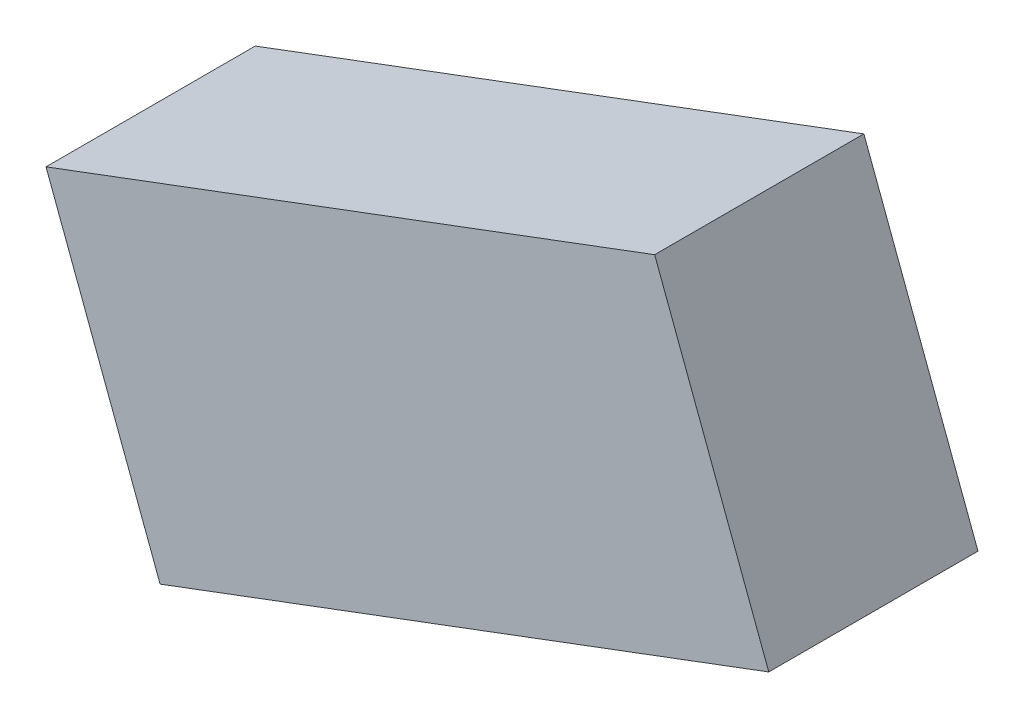
ISO-10303-21;
HEADER;
FILE_DESCRIPTION(('STEP AP214'),'2;1');
FILE_NAME('part.step','',(''),(''),'','','');
FILE_SCHEMA(('AUTOMOTIVE_DESIGN { 1 0 10303 214 1 1 1 1 }'));
ENDSEC;
DATA;
#1=APPLICATION_CONTEXT('core data for automotive mechanical design processes');
#2=APPLICATION_PROTOCOL_DEFINITION('international standard','automotive_design',2000,#1);
#3=PRODUCT_CONTEXT('',#1,'mechanical');
#4=PRODUCT('Part','Part','',(#3));
#5=PRODUCT_RELATED_PRODUCT_CATEGORY('part','',(#4));
#6=PRODUCT_DEFINITION_FORMATION('','',#4);
#7=PRODUCT_DEFINITION_CONTEXT('part definition',#1,'design');
#8=PRODUCT_DEFINITION('design','',#6,#7);
#9=PRODUCT_DEFINITION_SHAPE('','',#8);
#10=(LENGTH_UNIT() NAMED_UNIT(*) SI_UNIT(.MILLI.,.METRE.));
#11=(NAMED_UNIT(*) PLANE_ANGLE_UNIT() SI_UNIT($,.RADIAN.));
#12=(NAMED_UNIT(*) SI_UNIT($,.STERADIAN.) SOLID_ANGLE_UNIT());
#13=UNCERTAINTY_MEASURE_WITH_UNIT(LENGTH_MEASURE(1.E-05),#10,'distance_accuracy_value','');
#14=(GEOMETRIC_REPRESENTATION_CONTEXT(3) GLOBAL_UNCERTAINTY_ASSIGNED_CONTEXT((#13)) GLOBAL_UNIT_ASSIGNED_CONTEXT((#10,
#11,#12)) REPRESENTATION_CONTEXT('',''));
#15=CARTESIAN_POINT('',(0.,0.,0.));
#16=DIRECTION('',(0.,0.,1.));
#17=DIRECTION('',(1.,0.,0.));
#18=AXIS2_PLACEMENT_3D('',#15,#16,#17);
#19=CARTESIAN_POINT('',(-3.,20.,11.));
#20=DIRECTION('',(0.936329177569045,0.351123441588392,0.));
#21=DIRECTION('',(-0.351123441588392,0.936329177569045,0.));
#22=AXIS2_PLACEMENT_3D('',#19,#20,#21);
#23=PLANE('',#22);
#24=DIRECTION('',(0.351123441588392,-0.936329177569045,0.));
#25=VECTOR('',#24,1.);
#26=CARTESIAN_POINT('',(-3.,20.,0.));
#27=LINE('',#26,#25);
#28=CARTESIAN_POINT('',(-3.,20.,0.));
#29=VERTEX_POINT('',#28);
#30=CARTESIAN_POINT('',(3.,4.,0.));
#31=VERTEX_POINT('',#30);
#32=EDGE_CURVE('E104',#29,#31,#27,.T.);
#33=ORIENTED_EDGE('',*,*,#32,.T.);
#34=DIRECTION('',(0.,0.,-1.));
#35=VECTOR('',#34,1.);
#36=CARTESIAN_POINT('',(3.,4.,11.));
#37=LINE('',#36,#35);
#38=CARTESIAN_POINT('',(3.,4.,11.));
#39=VERTEX_POINT('',#38);
#40=EDGE_CURVE('E11',#39,#31,#37,.T.);
#41=ORIENTED_EDGE('',*,*,#40,.F.);
#42=DIRECTION('',(0.351123441588392,-0.936329177569045,0.));
#43=VECTOR('',#42,1.);
#44=CARTESIAN_POINT('',(-3.,20.,11.));
#45=LINE('',#44,#43);
#46=CARTESIAN_POINT('',(-3.,20.,11.));
#47=VERTEX_POINT('',#46);
#48=EDGE_CURVE('E92',#47,#39,#45,.T.);
#49=ORIENTED_EDGE('',*,*,#48,.F.);
#50=DIRECTION('',(0.,0.,-1.));
#51=VECTOR('',#50,1.);
#52=CARTESIAN_POINT('',(-3.,20.,11.));
#53=LINE('',#52,#51);
#54=EDGE_CURVE('E100',#47,#29,#53,.T.);
#55=ORIENTED_EDGE('',*,*,#54,.T.);
#56=EDGE_LOOP('',(#33,#41,#49,#55));
#57=FACE_BOUND('',#56,.T.);
#58=ADVANCED_FACE('F41',(#57),#23,.F.);
#59=CARTESIAN_POINT('',(3.,4.,11.));
#60=DIRECTION('',(-0.351123441588392,0.936329177569045,0.));
#61=DIRECTION('',(-0.936329177569044,-0.351123441588392,0.));
#62=AXIS2_PLACEMENT_3D('',#59,#60,#61);
#63=PLANE('',#62);
#64=DIRECTION('',(0.936329177569045,0.351123441588392,0.));
#65=VECTOR('',#64,1.);
#66=CARTESIAN_POINT('',(3.,4.,0.));
#67=LINE('',#66,#65);
#68=CARTESIAN_POINT('',(35.,16.,0.));
#69=VERTEX_POINT('',#68);
#70=EDGE_CURVE('E96',#31,#69,#67,.T.);
#71=ORIENTED_EDGE('',*,*,#70,.T.);
#72=DIRECTION('',(0.,0.,-1.));
#73=VECTOR('',#72,1.);
#74=CARTESIAN_POINT('',(35.,16.,11.));
#75=LINE('',#74,#73);
#76=CARTESIAN_POINT('',(35.,16.,11.));
#77=VERTEX_POINT('',#76);
#78=EDGE_CURVE('E49',#77,#69,#75,.T.);
#79=ORIENTED_EDGE('',*,*,#78,.F.);
#80=DIRECTION('',(0.936329177569045,0.351123441588392,0.));
#81=VECTOR('',#80,1.);
#82=CARTESIAN_POINT('',(3.,4.,11.));
#83=LINE('',#82,#81);
#84=EDGE_CURVE('E87',#39,#77,#83,.T.);
#85=ORIENTED_EDGE('',*,*,#84,.F.);
#86=ORIENTED_EDGE('',*,*,#40,.T.);
#87=EDGE_LOOP('',(#71,#79,#85,#86));
#88=FACE_BOUND('',#87,.T.);
#89=ADVANCED_FACE('F95',(#88),#63,.F.);
#90=CARTESIAN_POINT('',(35.,16.,11.));
#91=DIRECTION('',(-0.936329177569045,-0.351123441588392,0.));
#92=DIRECTION('',(0.351123441588392,-0.936329177569044,0.));
#93=AXIS2_PLACEMENT_3D('',#90,#91,#92);
#94=PLANE('',#93);
#95=DIRECTION('',(-0.351123441588392,0.936329177569045,0.));
#96=VECTOR('',#95,1.);
#97=CARTESIAN_POINT('',(35.,16.,0.));
#98=LINE('',#97,#96);
#99=CARTESIAN_POINT('',(29.,32.,0.));
#100=VERTEX_POINT('',#99);
#101=EDGE_CURVE('E74',#69,#100,#98,.T.);
#102=ORIENTED_EDGE('',*,*,#101,.T.);
#103=DIRECTION('',(0.,0.,-1.));
#104=VECTOR('',#103,1.);
#105=CARTESIAN_POINT('',(29.,32.,11.));
#106=LINE('',#105,#104);
#107=CARTESIAN_POINT('',(29.,32.,11.));
#108=VERTEX_POINT('',#107);
#109=EDGE_CURVE('E97',#108,#100,#106,.T.);
#110=ORIENTED_EDGE('',*,*,#109,.F.);
#111=DIRECTION('',(-0.351123441588392,0.936329177569045,0.));
#112=VECTOR('',#111,1.);
#113=CARTESIAN_POINT('',(35.,16.,11.));
#114=LINE('',#113,#112);
#115=EDGE_CURVE('E90',#77,#108,#114,.T.);
#116=ORIENTED_EDGE('',*,*,#115,.F.);
#117=ORIENTED_EDGE('',*,*,#78,.T.);
#118=EDGE_LOOP('',(#102,#110,#116,#117));
#119=FACE_BOUND('',#118,.T.);
#120=ADVANCED_FACE('F98',(#119),#94,.F.);
#121=CARTESIAN_POINT('',(29.,32.,11.));
#122=DIRECTION('',(0.351123441588392,-0.936329177569045,0.));
#123=DIRECTION('',(0.936329177569045,0.351123441588392,0.));
#124=AXIS2_PLACEMENT_3D('',#121,#122,#123);
#125=PLANE('',#124);
#126=DIRECTION('',(-0.936329177569045,-0.351123441588392,0.));
#127=VECTOR('',#126,1.);
#128=CARTESIAN_POINT('',(29.,32.,0.));
#129=LINE('',#128,#127);
#130=EDGE_CURVE('E80',#100,#29,#129,.T.);
#131=ORIENTED_EDGE('',*,*,#130,.T.);
#132=ORIENTED_EDGE('',*,*,#54,.F.);
#133=DIRECTION('',(-0.936329177569045,-0.351123441588392,0.));
#134=VECTOR('',#133,1.);
#135=CARTESIAN_POINT('',(29.,32.,11.));
#136=LINE('',#135,#134);
#137=EDGE_CURVE('E57',#108,#47,#136,.T.);
#138=ORIENTED_EDGE('',*,*,#137,.F.);
#139=ORIENTED_EDGE('',*,*,#109,.T.);
#140=EDGE_LOOP('',(#131,#132,#138,#139));
#141=FACE_BOUND('',#140,.T.);
#142=ADVANCED_FACE('F111',(#141),#125,.F.);
#143=CARTESIAN_POINT('',(0.,0.,11.));
#144=DIRECTION('',(0.,0.,1.));
#145=DIRECTION('',(1.,0.,0.));
#146=AXIS2_PLACEMENT_3D('',#143,#144,#145);
#147=PLANE('',#146);
#148=ORIENTED_EDGE('',*,*,#48,.T.);
#149=ORIENTED_EDGE('',*,*,#84,.T.);
#150=ORIENTED_EDGE('',*,*,#115,.T.);
#151=ORIENTED_EDGE('',*,*,#137,.T.);
#152=EDGE_LOOP('',(#148,#149,#150,#151));
#153=FACE_BOUND('',#152,.T.);
#154=ADVANCED_FACE('F88',(#153),#147,.T.);
#155=CARTESIAN_POINT('',(0.,0.,0.));
#156=DIRECTION('',(0.,0.,1.));
#157=DIRECTION('',(1.,0.,0.));
#158=AXIS2_PLACEMENT_3D('',#155,#156,#157);
#159=PLANE('',#158);
#160=ORIENTED_EDGE('',*,*,#32,.F.);
#161=ORIENTED_EDGE('',*,*,#130,.F.);
#162=ORIENTED_EDGE('',*,*,#101,.F.);
#163=ORIENTED_EDGE('',*,*,#70,.F.);
#164=EDGE_LOOP('',(#160,#161,#162,#163));
#165=FACE_BOUND('',#164,.T.);
#166=ADVANCED_FACE('F114',(#165),#159,.F.);
#167=CLOSED_SHELL('',(#58,#89,#120,#142,#154,#166));
#168=MANIFOLD_SOLID_BREP('B2',#167);
#169=ADVANCED_BREP_SHAPE_REPRESENTATION('',(#18,#168),#14);
#170=SHAPE_DEFINITION_REPRESENTATION(#9,#169);
ENDSEC;
END-ISO-10303-21;
